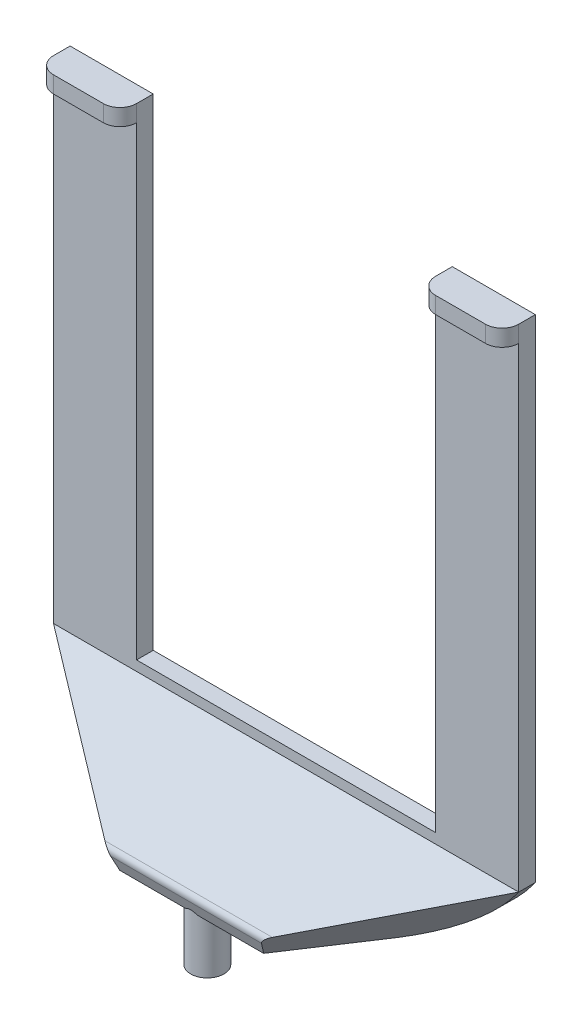
ISO-10303-21;
HEADER;
FILE_DESCRIPTION(('STEP AP214'),'2;1');
FILE_NAME('part.step','',(''),(''),'','','');
FILE_SCHEMA(('AUTOMOTIVE_DESIGN { 1 0 10303 214 1 1 1 1 }'));
ENDSEC;
DATA;
#1=APPLICATION_CONTEXT('core data for automotive mechanical design processes');
#2=APPLICATION_PROTOCOL_DEFINITION('international standard','automotive_design',2000,#1);
#3=PRODUCT_CONTEXT('',#1,'mechanical');
#4=PRODUCT('Part','Part','',(#3));
#5=PRODUCT_RELATED_PRODUCT_CATEGORY('part','',(#4));
#6=PRODUCT_DEFINITION_FORMATION('','',#4);
#7=PRODUCT_DEFINITION_CONTEXT('part definition',#1,'design');
#8=PRODUCT_DEFINITION('design','',#6,#7);
#9=PRODUCT_DEFINITION_SHAPE('','',#8);
#10=(LENGTH_UNIT() NAMED_UNIT(*) SI_UNIT(.MILLI.,.METRE.));
#11=(NAMED_UNIT(*) PLANE_ANGLE_UNIT() SI_UNIT($,.RADIAN.));
#12=(NAMED_UNIT(*) SI_UNIT($,.STERADIAN.) SOLID_ANGLE_UNIT());
#13=UNCERTAINTY_MEASURE_WITH_UNIT(LENGTH_MEASURE(1.E-05),#10,'distance_accuracy_value','');
#14=(GEOMETRIC_REPRESENTATION_CONTEXT(3) GLOBAL_UNCERTAINTY_ASSIGNED_CONTEXT((#13)) GLOBAL_UNIT_ASSIGNED_CONTEXT((#10,
#11,#12)) REPRESENTATION_CONTEXT('',''));
#15=CARTESIAN_POINT('',(0.,0.,0.));
#16=DIRECTION('',(0.,0.,1.));
#17=DIRECTION('',(1.,0.,0.));
#18=AXIS2_PLACEMENT_3D('',#15,#16,#17);
#19=CARTESIAN_POINT('',(-91.3559501162544,-90.8333333333333,5.));
#20=DIRECTION('',(1.,0.,0.));
#21=DIRECTION('',(0.,0.,-1.));
#22=AXIS2_PLACEMENT_3D('',#19,#20,#21);
#23=PLANE('',#22);
#24=DIRECTION('',(0.,0.,-1.));
#25=VECTOR('',#24,1.);
#26=CARTESIAN_POINT('',(-91.3559501162544,-93.8392083361771,25.));
#27=LINE('',#26,#25);
#28=CARTESIAN_POINT('',(-91.3559501162544,-93.8392083361771,5.));
#29=VERTEX_POINT('',#28);
#30=CARTESIAN_POINT('',(-91.3559501162544,-93.8392083361771,0.));
#31=VERTEX_POINT('',#30);
#32=EDGE_CURVE('E181',#29,#31,#27,.T.);
#33=ORIENTED_EDGE('',*,*,#32,.F.);
#34=DIRECTION('',(0.,-1.,0.));
#35=VECTOR('',#34,1.);
#36=CARTESIAN_POINT('',(-91.3559501162544,49.1666666666667,5.));
#37=LINE('',#36,#35);
#38=CARTESIAN_POINT('',(-91.3559501162544,49.1666666666667,5.));
#39=VERTEX_POINT('',#38);
#40=EDGE_CURVE('E227',#39,#29,#37,.T.);
#41=ORIENTED_EDGE('',*,*,#40,.F.);
#42=DIRECTION('',(0.,1.,0.));
#43=VECTOR('',#42,1.);
#44=CARTESIAN_POINT('',(-91.3559501162543,49.1666666666667,5.));
#45=LINE('',#44,#43);
#46=CARTESIAN_POINT('',(-91.3559501162543,54.1666666666667,5.));
#47=VERTEX_POINT('',#46);
#48=EDGE_CURVE('E325',#39,#47,#45,.T.);
#49=ORIENTED_EDGE('',*,*,#48,.T.);
#50=DIRECTION('',(0.,0.,1.));
#51=VECTOR('',#50,1.);
#52=CARTESIAN_POINT('',(-91.3559501162544,54.1666666666667,0.));
#53=LINE('',#52,#51);
#54=CARTESIAN_POINT('',(-91.3559501162544,54.1666666666667,0.));
#55=VERTEX_POINT('',#54);
#56=EDGE_CURVE('E206',#55,#47,#53,.T.);
#57=ORIENTED_EDGE('',*,*,#56,.F.);
#58=DIRECTION('',(0.,-1.,0.));
#59=VECTOR('',#58,1.);
#60=CARTESIAN_POINT('',(-91.3559501162544,-90.8333333333333,0.));
#61=LINE('',#60,#59);
#62=EDGE_CURVE('E197',#55,#31,#61,.T.);
#63=ORIENTED_EDGE('',*,*,#62,.T.);
#64=EDGE_LOOP('',(#33,#41,#49,#57,#63));
#65=FACE_BOUND('',#64,.T.);
#66=ADVANCED_FACE('F39',(#65),#23,.F.);
#67=CARTESIAN_POINT('',(48.6440498837456,-105.833333333333,0.));
#68=DIRECTION('',(0.,-0.923010028663806,-0.38477589189818));
#69=DIRECTION('',(0.,0.38477589189818,-0.923010028663806));
#70=AXIS2_PLACEMENT_3D('',#67,#68,#69);
#71=PLANE('',#70);
#72=DIRECTION('',(0.780333099666153,-0.240625028106991,0.577217332911896));
#73=VECTOR('',#72,1.);
#74=CARTESIAN_POINT('',(-4.87227608097444,-131.527895914669,61.6367590695583));
#75=LINE('',#74,#73);
#76=CARTESIAN_POINT('',(-66.3559501162543,-112.568670938579,16.1568962270722));
#77=VERTEX_POINT('',#76);
#78=CARTESIAN_POINT('',(-43.0055418271007,-119.769048127873,33.4293410340853));
#79=VERTEX_POINT('',#78);
#80=EDGE_CURVE('E240',#77,#79,#75,.T.);
#81=ORIENTED_EDGE('',*,*,#80,.F.);
#82=CARTESIAN_POINT('',(-50.3771916076654,-65.1906245824425,-97.4947457962397));
#83=DIRECTION('',(0.,-0.923010028663806,-0.38477589189818));
#84=DIRECTION('',(0.,0.38477589189818,-0.923010028663806));
#85=AXIS2_PLACEMENT_3D('',#82,#83,#84);
#86=ELLIPSE('',#85,129.945771169133,50.);
#87=CARTESIAN_POINT('',(-79.5005538000749,-105.833333333333,0.));
#88=VERTEX_POINT('',#87);
#89=EDGE_CURVE('E195',#77,#88,#86,.T.);
#90=ORIENTED_EDGE('',*,*,#89,.T.);
#91=DIRECTION('',(1.,0.,0.));
#92=VECTOR('',#91,1.);
#93=CARTESIAN_POINT('',(-91.3559501162544,-105.833333333333,0.));
#94=LINE('',#93,#92);
#95=CARTESIAN_POINT('',(36.7886535675662,-105.833333333333,0.));
#96=VERTEX_POINT('',#95);
#97=EDGE_CURVE('E205',#88,#96,#94,.T.);
#98=ORIENTED_EDGE('',*,*,#97,.T.);
#99=CARTESIAN_POINT('',(7.66529137515671,-65.1906245824425,-97.4947457962397));
#100=DIRECTION('',(0.,-0.923010028663806,-0.38477589189818));
#101=DIRECTION('',(0.,0.38477589189818,-0.923010028663806));
#102=AXIS2_PLACEMENT_3D('',#99,#100,#101);
#103=ELLIPSE('',#102,129.945771169133,50.);
#104=CARTESIAN_POINT('',(23.6440498837456,-112.568670938579,16.1568962270722));
#105=VERTEX_POINT('',#104);
#106=EDGE_CURVE('E369',#96,#105,#103,.T.);
#107=ORIENTED_EDGE('',*,*,#106,.T.);
#108=DIRECTION('',(0.780333099666153,0.240625028106991,-0.577217332911896));
#109=VECTOR('',#108,1.);
#110=CARTESIAN_POINT('',(47.4091403493079,-105.240421549071,-1.42229161054553));
#111=LINE('',#110,#109);
#112=CARTESIAN_POINT('',(0.293641594591942,-119.769048127873,33.4293410340853));
#113=VERTEX_POINT('',#112);
#114=EDGE_CURVE('E234',#113,#105,#111,.T.);
#115=ORIENTED_EDGE('',*,*,#114,.F.);
#116=DIRECTION('',(-1.,0.,0.));
#117=VECTOR('',#116,1.);
#118=CARTESIAN_POINT('',(48.6440498837456,-119.769048127873,33.4293410340853));
#119=LINE('',#118,#117);
#120=CARTESIAN_POINT('',(-19.688792021063,-119.769048127873,33.4293410340853));
#121=VERTEX_POINT('',#120);
#122=EDGE_CURVE('E267',#113,#121,#119,.T.);
#123=ORIENTED_EDGE('',*,*,#122,.T.);
#124=CARTESIAN_POINT('',(-21.3559501162544,-117.803972962328,28.7154696012142));
#125=DIRECTION('',(0.,-0.923010028663806,-0.38477589189818));
#126=DIRECTION('',(0.,0.38477589189818,-0.923010028663806));
#127=AXIS2_PLACEMENT_3D('',#124,#125,#126);
#128=ELLIPSE('',#127,5.41705923524822,5.);
#129=CARTESIAN_POINT('',(-19.7270256894861,-115.833333333333,23.9882499943124));
#130=VERTEX_POINT('',#129);
#131=EDGE_CURVE('E244',#130,#121,#128,.T.);
#132=ORIENTED_EDGE('',*,*,#131,.F.);
#133=DIRECTION('',(1.,0.,0.));
#134=VECTOR('',#133,1.);
#135=CARTESIAN_POINT('',(48.6440498837457,-115.833333333333,23.9882499943123));
#136=LINE('',#135,#134);
#137=CARTESIAN_POINT('',(-22.9848745430227,-115.833333333333,23.9882499943124));
#138=VERTEX_POINT('',#137);
#139=EDGE_CURVE('E237',#138,#130,#136,.T.);
#140=ORIENTED_EDGE('',*,*,#139,.F.);
#141=CARTESIAN_POINT('',(-23.0231082114457,-119.769048127873,33.4293410340853));
#142=VERTEX_POINT('',#141);
#143=EDGE_CURVE('E245',#142,#138,#128,.T.);
#144=ORIENTED_EDGE('',*,*,#143,.F.);
#145=EDGE_CURVE('E266',#142,#79,#119,.T.);
#146=ORIENTED_EDGE('',*,*,#145,.T.);
#147=EDGE_LOOP('',(#81,#90,#98,#107,#115,#123,#132,#140,#144,#146));
#148=FACE_BOUND('',#147,.T.);
#149=ADVANCED_FACE('F368',(#148),#71,.T.);
#150=CARTESIAN_POINT('',(48.6440498837456,-110.488005958166,-6.08230741957848));
#151=DIRECTION('',(-0.618266037198711,0.435517447007861,-0.654271855269931));
#152=DIRECTION('',(-0.726823129770258,0.,0.68682467779701));
#153=AXIS2_PLACEMENT_3D('',#150,#151,#152);
#154=PLANE('',#153);
#155=DIRECTION('',(-0.785968897124182,-0.342590714566033,0.514669306493532));
#156=VECTOR('',#155,1.);
#157=CARTESIAN_POINT('',(48.6440498837456,-93.8392083361771,4.99999999999999));
#158=LINE('',#157,#156);
#159=CARTESIAN_POINT('',(48.6440498837456,-93.8392083361771,4.99999999999999));
#160=VERTEX_POINT('',#159);
#161=CARTESIAN_POINT('',(3.83254399093332,-113.371795288117,34.3435360421655));
#162=VERTEX_POINT('',#161);
#163=EDGE_CURVE('E412',#160,#162,#158,.T.);
#164=ORIENTED_EDGE('',*,*,#163,.T.);
#165=CARTESIAN_POINT('',(3.83254399093332,-115.036675050316,33.2353053002077));
#166=DIRECTION('',(-0.618266037198711,0.435517447007861,-0.654271855269931));
#167=DIRECTION('',(-0.785968897124182,-0.342590714566033,0.514669306493532));
#168=AXIS2_PLACEMENT_3D('',#165,#166,#167);
#169=ELLIPSE('',#168,3.23485341207122,2.);
#170=CARTESIAN_POINT('',(1.33693190299864,-115.806226834112,35.0813253575353));
#171=VERTEX_POINT('',#170);
#172=EDGE_CURVE('E11',#162,#171,#169,.F.);
#173=ORIENTED_EDGE('',*,*,#172,.T.);
#174=DIRECTION('',(-0.236128838705692,-0.896908926071469,-0.37389510543042));
#175=VECTOR('',#174,1.);
#176=CARTESIAN_POINT('',(2.98950701595217,-109.529105505197,37.6980736949105));
#177=LINE('',#176,#175);
#178=EDGE_CURVE('E258',#171,#113,#177,.T.);
#179=ORIENTED_EDGE('',*,*,#178,.T.);
#180=ORIENTED_EDGE('',*,*,#114,.T.);
#181=CARTESIAN_POINT('',(7.66529137515671,-65.1906245824425,62.7936103848535));
#182=DIRECTION('',(-0.618266037198711,0.435517447007861,-0.654271855269931));
#183=DIRECTION('',(0.534887958064135,-0.376784464802276,-0.756259439214905));
#184=AXIS2_PLACEMENT_3D('',#181,#182,#183);
#185=ELLIPSE('',#184,76.4208327123771,50.);
#186=EDGE_CURVE('E250',#160,#105,#185,.T.);
#187=ORIENTED_EDGE('',*,*,#186,.F.);
#188=EDGE_LOOP('',(#164,#173,#179,#180,#187));
#189=FACE_BOUND('',#188,.T.);
#190=ADVANCED_FACE('F416',(#189),#154,.F.);
#191=CARTESIAN_POINT('',(-91.3559501162544,-110.488005958166,-6.08230741957848));
#192=DIRECTION('',(0.618266037198711,0.435517447007861,-0.654271855269931));
#193=DIRECTION('',(-0.726823129770258,0.,-0.68682467779701));
#194=AXIS2_PLACEMENT_3D('',#191,#192,#193);
#195=PLANE('',#194);
#196=DIRECTION('',(-0.236128838705692,0.896908926071469,0.37389510543042));
#197=VECTOR('',#196,1.);
#198=CARTESIAN_POINT('',(-37.8954512628711,-139.17915434452,25.3378353088866));
#199=LINE('',#198,#197);
#200=CARTESIAN_POINT('',(-44.0488321355074,-115.806226834113,35.0813253575353));
#201=VERTEX_POINT('',#200);
#202=EDGE_CURVE('E259',#79,#201,#199,.T.);
#203=ORIENTED_EDGE('',*,*,#202,.T.);
#204=CARTESIAN_POINT('',(-46.5444442234421,-115.036675050316,33.2353053002077));
#205=DIRECTION('',(0.618266037198711,0.435517447007861,-0.654271855269931));
#206=DIRECTION('',(-0.785968897124182,0.342590714566033,-0.514669306493532));
#207=AXIS2_PLACEMENT_3D('',#204,#205,#206);
#208=ELLIPSE('',#207,3.23485341207122,2.);
#209=CARTESIAN_POINT('',(-46.5444442234421,-113.371795288117,34.3435360421655));
#210=VERTEX_POINT('',#209);
#211=EDGE_CURVE('E62',#201,#210,#208,.F.);
#212=ORIENTED_EDGE('',*,*,#211,.T.);
#213=DIRECTION('',(-0.785968897124182,0.342590714566033,-0.514669306493532));
#214=VECTOR('',#213,1.);
#215=CARTESIAN_POINT('',(-91.3559501162544,-93.8392083361771,4.99999999999999));
#216=LINE('',#215,#214);
#217=EDGE_CURVE('E269',#210,#29,#216,.T.);
#218=ORIENTED_EDGE('',*,*,#217,.T.);
#219=CARTESIAN_POINT('',(-50.3771916076654,-65.1906245824425,62.7936103848535));
#220=DIRECTION('',(0.618266037198711,0.435517447007861,-0.654271855269931));
#221=DIRECTION('',(-0.534887958064135,-0.376784464802276,-0.756259439214905));
#222=AXIS2_PLACEMENT_3D('',#219,#220,#221);
#223=ELLIPSE('',#222,76.4208327123771,50.);
#224=EDGE_CURVE('E190',#77,#29,#223,.T.);
#225=ORIENTED_EDGE('',*,*,#224,.F.);
#226=ORIENTED_EDGE('',*,*,#80,.T.);
#227=EDGE_LOOP('',(#203,#212,#218,#225,#226));
#228=FACE_BOUND('',#227,.T.);
#229=ADVANCED_FACE('F262',(#228),#195,.F.);
#230=CARTESIAN_POINT('',(48.6440498837456,49.1666666666668,5.));
#231=DIRECTION('',(-1.,0.,0.));
#232=DIRECTION('',(0.,-1.,0.));
#233=AXIS2_PLACEMENT_3D('',#230,#231,#232);
#234=PLANE('',#233);
#235=DIRECTION('',(0.,1.,0.));
#236=VECTOR('',#235,1.);
#237=CARTESIAN_POINT('',(48.6440498837456,-90.8333333333332,5.));
#238=LINE('',#237,#236);
#239=CARTESIAN_POINT('',(48.6440498837456,49.1666666666667,5.));
#240=VERTEX_POINT('',#239);
#241=EDGE_CURVE('E305',#160,#240,#238,.T.);
#242=ORIENTED_EDGE('',*,*,#241,.F.);
#243=DIRECTION('',(0.,0.,-1.));
#244=VECTOR('',#243,1.);
#245=CARTESIAN_POINT('',(48.6440498837457,-93.8392083361771,25.));
#246=LINE('',#245,#244);
#247=CARTESIAN_POINT('',(48.6440498837457,-93.8392083361771,0.));
#248=VERTEX_POINT('',#247);
#249=EDGE_CURVE('E361',#160,#248,#246,.T.);
#250=ORIENTED_EDGE('',*,*,#249,.T.);
#251=DIRECTION('',(0.,1.,0.));
#252=VECTOR('',#251,1.);
#253=CARTESIAN_POINT('',(48.6440498837456,49.1666666666668,0.));
#254=LINE('',#253,#252);
#255=CARTESIAN_POINT('',(48.6440498837456,54.1666666666667,0.));
#256=VERTEX_POINT('',#255);
#257=EDGE_CURVE('E212',#248,#256,#254,.T.);
#258=ORIENTED_EDGE('',*,*,#257,.T.);
#259=DIRECTION('',(0.,0.,-1.));
#260=VECTOR('',#259,1.);
#261=CARTESIAN_POINT('',(48.6440498837456,54.1666666666667,0.));
#262=LINE('',#261,#260);
#263=CARTESIAN_POINT('',(48.6440498837456,54.1666666666667,5.));
#264=VERTEX_POINT('',#263);
#265=EDGE_CURVE('E291',#264,#256,#262,.T.);
#266=ORIENTED_EDGE('',*,*,#265,.F.);
#267=DIRECTION('',(0.,1.,0.));
#268=VECTOR('',#267,1.);
#269=CARTESIAN_POINT('',(48.6440498837456,49.1666666666667,5.));
#270=LINE('',#269,#268);
#271=EDGE_CURVE('E363',#240,#264,#270,.T.);
#272=ORIENTED_EDGE('',*,*,#271,.F.);
#273=EDGE_LOOP('',(#242,#250,#258,#266,#272));
#274=FACE_BOUND('',#273,.T.);
#275=ADVANCED_FACE('F359',(#274),#234,.F.);
#276=CARTESIAN_POINT('',(-66.3559501162544,49.1666666666667,5.));
#277=DIRECTION('',(-1.,0.,0.));
#278=DIRECTION('',(0.,-1.,0.));
#279=AXIS2_PLACEMENT_3D('',#276,#277,#278);
#280=PLANE('',#279);
#281=DIRECTION('',(0.,1.,0.));
#282=VECTOR('',#281,1.);
#283=CARTESIAN_POINT('',(-66.3559501162543,49.1666666666667,5.));
#284=LINE('',#283,#282);
#285=CARTESIAN_POINT('',(-66.3559501162543,49.1666666666667,5.));
#286=VERTEX_POINT('',#285);
#287=CARTESIAN_POINT('',(-66.3559501162543,54.1666666666667,5.));
#288=VERTEX_POINT('',#287);
#289=EDGE_CURVE('E375',#286,#288,#284,.T.);
#290=ORIENTED_EDGE('',*,*,#289,.F.);
#291=DIRECTION('',(0.,1.,0.));
#292=VECTOR('',#291,1.);
#293=CARTESIAN_POINT('',(-66.3559501162544,49.1666666666667,5.));
#294=LINE('',#293,#292);
#295=CARTESIAN_POINT('',(-66.3559501162544,-90.8333333333333,5.));
#296=VERTEX_POINT('',#295);
#297=EDGE_CURVE('E311',#296,#286,#294,.T.);
#298=ORIENTED_EDGE('',*,*,#297,.F.);
#299=DIRECTION('',(0.,0.,-1.));
#300=VECTOR('',#299,1.);
#301=CARTESIAN_POINT('',(-66.3559501162544,-90.8333333333333,5.));
#302=LINE('',#301,#300);
#303=CARTESIAN_POINT('',(-66.3559501162544,-90.8333333333333,0.));
#304=VERTEX_POINT('',#303);
#305=EDGE_CURVE('E226',#296,#304,#302,.T.);
#306=ORIENTED_EDGE('',*,*,#305,.T.);
#307=DIRECTION('',(0.,1.,0.));
#308=VECTOR('',#307,1.);
#309=CARTESIAN_POINT('',(-66.3559501162544,49.1666666666667,0.));
#310=LINE('',#309,#308);
#311=CARTESIAN_POINT('',(-66.3559501162544,54.1666666666667,0.));
#312=VERTEX_POINT('',#311);
#313=EDGE_CURVE('E223',#304,#312,#310,.T.);
#314=ORIENTED_EDGE('',*,*,#313,.T.);
#315=DIRECTION('',(0.,0.,-1.));
#316=VECTOR('',#315,1.);
#317=CARTESIAN_POINT('',(-66.3559501162544,54.1666666666667,0.));
#318=LINE('',#317,#316);
#319=EDGE_CURVE('E214',#288,#312,#318,.T.);
#320=ORIENTED_EDGE('',*,*,#319,.F.);
#321=EDGE_LOOP('',(#290,#298,#306,#314,#320));
#322=FACE_BOUND('',#321,.T.);
#323=ADVANCED_FACE('F336',(#322),#280,.F.);
#324=CARTESIAN_POINT('',(-91.3559501162544,54.1666666666667,10.));
#325=DIRECTION('',(0.,0.,-1.));
#326=DIRECTION('',(-1.,0.,0.));
#327=AXIS2_PLACEMENT_3D('',#324,#325,#326);
#328=PLANE('',#327);
#329=DIRECTION('',(0.,1.,0.));
#330=VECTOR('',#329,1.);
#331=CARTESIAN_POINT('',(-86.3559506376234,49.1666666666667,10.));
#332=LINE('',#331,#330);
#333=CARTESIAN_POINT('',(-86.3559506376234,49.1666666666667,10.));
#334=VERTEX_POINT('',#333);
#335=CARTESIAN_POINT('',(-86.3559506376234,54.1666666666667,10.));
#336=VERTEX_POINT('',#335);
#337=EDGE_CURVE('E323',#334,#336,#332,.T.);
#338=ORIENTED_EDGE('',*,*,#337,.F.);
#339=DIRECTION('',(1.,0.,0.));
#340=VECTOR('',#339,1.);
#341=CARTESIAN_POINT('',(-91.3559501162544,49.1666666666667,10.));
#342=LINE('',#341,#340);
#343=CARTESIAN_POINT('',(-71.3559495948853,49.1666666666667,10.));
#344=VERTEX_POINT('',#343);
#345=EDGE_CURVE('E283',#334,#344,#342,.T.);
#346=ORIENTED_EDGE('',*,*,#345,.T.);
#347=DIRECTION('',(0.,1.,0.));
#348=VECTOR('',#347,1.);
#349=CARTESIAN_POINT('',(-71.3559495948853,49.1666666666667,10.));
#350=LINE('',#349,#348);
#351=CARTESIAN_POINT('',(-71.3559495948853,54.1666666666667,10.));
#352=VERTEX_POINT('',#351);
#353=EDGE_CURVE('E376',#344,#352,#350,.T.);
#354=ORIENTED_EDGE('',*,*,#353,.T.);
#355=DIRECTION('',(1.,0.,0.));
#356=VECTOR('',#355,1.);
#357=CARTESIAN_POINT('',(-91.3559501162544,54.1666666666667,10.));
#358=LINE('',#357,#356);
#359=EDGE_CURVE('E278',#336,#352,#358,.T.);
#360=ORIENTED_EDGE('',*,*,#359,.F.);
#361=EDGE_LOOP('',(#338,#346,#354,#360));
#362=FACE_BOUND('',#361,.T.);
#363=ADVANCED_FACE('F439',(#362),#328,.F.);
#364=CARTESIAN_POINT('',(0.,54.1666666666667,0.));
#365=DIRECTION('',(0.,1.,0.));
#366=DIRECTION('',(0.,0.,1.));
#367=AXIS2_PLACEMENT_3D('',#364,#365,#366);
#368=PLANE('',#367);
#369=CARTESIAN_POINT('',(-86.3559506376234,54.1666666666667,5.));
#370=DIRECTION('',(0.,-1.,0.));
#371=DIRECTION('',(0.,0.,1.));
#372=AXIS2_PLACEMENT_3D('',#369,#370,#371);
#373=CIRCLE('',#372,4.99999973931547);
#374=EDGE_CURVE('E326',#336,#47,#373,.T.);
#375=ORIENTED_EDGE('',*,*,#374,.F.);
#376=ORIENTED_EDGE('',*,*,#359,.T.);
#377=CARTESIAN_POINT('',(-71.3559495948853,54.1666666666667,5.));
#378=DIRECTION('',(0.,-1.,0.));
#379=DIRECTION('',(0.,0.,-1.));
#380=AXIS2_PLACEMENT_3D('',#377,#378,#379);
#381=CIRCLE('',#380,4.99999973931547);
#382=EDGE_CURVE('E382',#288,#352,#381,.T.);
#383=ORIENTED_EDGE('',*,*,#382,.F.);
#384=ORIENTED_EDGE('',*,*,#319,.T.);
#385=DIRECTION('',(-1.,0.,0.));
#386=VECTOR('',#385,1.);
#387=CARTESIAN_POINT('',(-91.3559501162544,54.1666666666667,0.));
#388=LINE('',#387,#386);
#389=EDGE_CURVE('E209',#312,#55,#388,.T.);
#390=ORIENTED_EDGE('',*,*,#389,.T.);
#391=ORIENTED_EDGE('',*,*,#56,.T.);
#392=EDGE_LOOP('',(#375,#376,#383,#384,#390,#391));
#393=FACE_BOUND('',#392,.T.);
#394=ADVANCED_FACE('F330',(#393),#368,.T.);
#395=CARTESIAN_POINT('',(0.,49.1666666666667,0.));
#396=DIRECTION('',(0.,1.,0.));
#397=DIRECTION('',(0.,0.,1.));
#398=AXIS2_PLACEMENT_3D('',#395,#396,#397);
#399=PLANE('',#398);
#400=ORIENTED_EDGE('',*,*,#345,.F.);
#401=CARTESIAN_POINT('',(-86.3559506376234,49.1666666666667,5.));
#402=DIRECTION('',(0.,-1.,0.));
#403=DIRECTION('',(0.,0.,1.));
#404=AXIS2_PLACEMENT_3D('',#401,#402,#403);
#405=CIRCLE('',#404,4.99999973931547);
#406=EDGE_CURVE('E321',#334,#39,#405,.T.);
#407=ORIENTED_EDGE('',*,*,#406,.T.);
#408=DIRECTION('',(-1.,0.,0.));
#409=VECTOR('',#408,1.);
#410=CARTESIAN_POINT('',(-91.3559501162544,49.1666666666667,5.));
#411=LINE('',#410,#409);
#412=EDGE_CURVE('E218',#286,#39,#411,.T.);
#413=ORIENTED_EDGE('',*,*,#412,.F.);
#414=CARTESIAN_POINT('',(-71.3559495948853,49.1666666666667,5.));
#415=DIRECTION('',(0.,-1.,0.));
#416=DIRECTION('',(0.,0.,-1.));
#417=AXIS2_PLACEMENT_3D('',#414,#415,#416);
#418=CIRCLE('',#417,4.99999973931547);
#419=EDGE_CURVE('E378',#286,#344,#418,.T.);
#420=ORIENTED_EDGE('',*,*,#419,.T.);
#421=EDGE_LOOP('',(#400,#407,#413,#420));
#422=FACE_BOUND('',#421,.T.);
#423=ADVANCED_FACE('F451',(#422),#399,.F.);
#424=CARTESIAN_POINT('',(23.6440498837456,54.1666666666667,10.));
#425=DIRECTION('',(0.,0.,-1.));
#426=DIRECTION('',(-1.,0.,0.));
#427=AXIS2_PLACEMENT_3D('',#424,#425,#426);
#428=PLANE('',#427);
#429=DIRECTION('',(1.,0.,0.));
#430=VECTOR('',#429,1.);
#431=CARTESIAN_POINT('',(23.6440498837456,49.1666666666667,10.));
#432=LINE('',#431,#430);
#433=CARTESIAN_POINT('',(28.6440493623766,49.1666666666667,10.));
#434=VERTEX_POINT('',#433);
#435=CARTESIAN_POINT('',(43.6440504051147,49.1666666666667,10.));
#436=VERTEX_POINT('',#435);
#437=EDGE_CURVE('E290',#434,#436,#432,.T.);
#438=ORIENTED_EDGE('',*,*,#437,.T.);
#439=DIRECTION('',(0.,1.,0.));
#440=VECTOR('',#439,1.);
#441=CARTESIAN_POINT('',(43.6440504051147,49.1666666666667,10.));
#442=LINE('',#441,#440);
#443=CARTESIAN_POINT('',(43.6440504051147,54.1666666666667,10.));
#444=VERTEX_POINT('',#443);
#445=EDGE_CURVE('E381',#436,#444,#442,.T.);
#446=ORIENTED_EDGE('',*,*,#445,.T.);
#447=DIRECTION('',(1.,0.,0.));
#448=VECTOR('',#447,1.);
#449=CARTESIAN_POINT('',(23.6440498837456,54.1666666666667,10.));
#450=LINE('',#449,#448);
#451=CARTESIAN_POINT('',(28.6440493623766,54.1666666666667,10.));
#452=VERTEX_POINT('',#451);
#453=EDGE_CURVE('E298',#452,#444,#450,.T.);
#454=ORIENTED_EDGE('',*,*,#453,.F.);
#455=DIRECTION('',(0.,1.,0.));
#456=VECTOR('',#455,1.);
#457=CARTESIAN_POINT('',(28.6440493623766,49.1666666666667,10.));
#458=LINE('',#457,#456);
#459=EDGE_CURVE('E402',#434,#452,#458,.T.);
#460=ORIENTED_EDGE('',*,*,#459,.F.);
#461=EDGE_LOOP('',(#438,#446,#454,#460));
#462=FACE_BOUND('',#461,.T.);
#463=ADVANCED_FACE('F449',(#462),#428,.F.);
#464=CARTESIAN_POINT('',(0.,54.1666666666667,0.));
#465=DIRECTION('',(0.,1.,0.));
#466=DIRECTION('',(0.,0.,1.));
#467=AXIS2_PLACEMENT_3D('',#464,#465,#466);
#468=PLANE('',#467);
#469=CARTESIAN_POINT('',(43.6440504051147,54.1666666666667,5.));
#470=DIRECTION('',(0.,-1.,0.));
#471=DIRECTION('',(0.,0.,-1.));
#472=AXIS2_PLACEMENT_3D('',#469,#470,#471);
#473=CIRCLE('',#472,4.99999973931548);
#474=EDGE_CURVE('E358',#264,#444,#473,.T.);
#475=ORIENTED_EDGE('',*,*,#474,.F.);
#476=ORIENTED_EDGE('',*,*,#265,.T.);
#477=DIRECTION('',(-1.,0.,0.));
#478=VECTOR('',#477,1.);
#479=CARTESIAN_POINT('',(23.6440498837456,54.1666666666667,0.));
#480=LINE('',#479,#478);
#481=CARTESIAN_POINT('',(23.6440498837456,54.1666666666667,0.));
#482=VERTEX_POINT('',#481);
#483=EDGE_CURVE('E277',#256,#482,#480,.T.);
#484=ORIENTED_EDGE('',*,*,#483,.T.);
#485=DIRECTION('',(0.,0.,1.));
#486=VECTOR('',#485,1.);
#487=CARTESIAN_POINT('',(23.6440498837456,54.1666666666667,0.));
#488=LINE('',#487,#486);
#489=CARTESIAN_POINT('',(23.6440498837456,54.1666666666667,5.));
#490=VERTEX_POINT('',#489);
#491=EDGE_CURVE('E289',#482,#490,#488,.T.);
#492=ORIENTED_EDGE('',*,*,#491,.T.);
#493=CARTESIAN_POINT('',(28.6440493623766,54.1666666666667,5.));
#494=DIRECTION('',(0.,-1.,0.));
#495=DIRECTION('',(0.,0.,1.));
#496=AXIS2_PLACEMENT_3D('',#493,#494,#495);
#497=CIRCLE('',#496,4.99999973931548);
#498=EDGE_CURVE('E388',#452,#490,#497,.T.);
#499=ORIENTED_EDGE('',*,*,#498,.F.);
#500=ORIENTED_EDGE('',*,*,#453,.T.);
#501=EDGE_LOOP('',(#475,#476,#484,#492,#499,#500));
#502=FACE_BOUND('',#501,.T.);
#503=ADVANCED_FACE('F352',(#502),#468,.T.);
#504=CARTESIAN_POINT('',(0.,49.1666666666667,0.));
#505=DIRECTION('',(0.,1.,0.));
#506=DIRECTION('',(0.,0.,1.));
#507=AXIS2_PLACEMENT_3D('',#504,#505,#506);
#508=PLANE('',#507);
#509=DIRECTION('',(-1.,0.,0.));
#510=VECTOR('',#509,1.);
#511=CARTESIAN_POINT('',(23.6440498837456,49.1666666666668,5.));
#512=LINE('',#511,#510);
#513=CARTESIAN_POINT('',(23.6440498837456,49.1666666666668,5.));
#514=VERTEX_POINT('',#513);
#515=EDGE_CURVE('E304',#240,#514,#512,.T.);
#516=ORIENTED_EDGE('',*,*,#515,.F.);
#517=CARTESIAN_POINT('',(43.6440504051147,49.1666666666667,5.));
#518=DIRECTION('',(0.,-1.,0.));
#519=DIRECTION('',(0.,0.,-1.));
#520=AXIS2_PLACEMENT_3D('',#517,#518,#519);
#521=CIRCLE('',#520,4.99999973931548);
#522=EDGE_CURVE('E390',#240,#436,#521,.T.);
#523=ORIENTED_EDGE('',*,*,#522,.T.);
#524=ORIENTED_EDGE('',*,*,#437,.F.);
#525=CARTESIAN_POINT('',(28.6440493623766,49.1666666666667,5.));
#526=DIRECTION('',(0.,-1.,0.));
#527=DIRECTION('',(0.,0.,1.));
#528=AXIS2_PLACEMENT_3D('',#525,#526,#527);
#529=CIRCLE('',#528,4.99999973931548);
#530=EDGE_CURVE('E396',#434,#514,#529,.T.);
#531=ORIENTED_EDGE('',*,*,#530,.T.);
#532=EDGE_LOOP('',(#516,#523,#524,#531));
#533=FACE_BOUND('',#532,.T.);
#534=ADVANCED_FACE('F434',(#533),#508,.F.);
#535=CARTESIAN_POINT('',(23.6440498837456,49.1666666666668,5.));
#536=DIRECTION('',(1.,0.,0.));
#537=DIRECTION('',(0.,1.,0.));
#538=AXIS2_PLACEMENT_3D('',#535,#536,#537);
#539=PLANE('',#538);
#540=DIRECTION('',(0.,-1.,0.));
#541=VECTOR('',#540,1.);
#542=CARTESIAN_POINT('',(23.6440498837456,49.1666666666668,5.));
#543=LINE('',#542,#541);
#544=CARTESIAN_POINT('',(23.6440498837456,-90.8333333333332,5.));
#545=VERTEX_POINT('',#544);
#546=EDGE_CURVE('E308',#514,#545,#543,.T.);
#547=ORIENTED_EDGE('',*,*,#546,.F.);
#548=DIRECTION('',(0.,1.,0.));
#549=VECTOR('',#548,1.);
#550=CARTESIAN_POINT('',(23.6440498837456,49.1666666666667,5.));
#551=LINE('',#550,#549);
#552=EDGE_CURVE('E398',#514,#490,#551,.T.);
#553=ORIENTED_EDGE('',*,*,#552,.T.);
#554=ORIENTED_EDGE('',*,*,#491,.F.);
#555=DIRECTION('',(0.,-1.,0.));
#556=VECTOR('',#555,1.);
#557=CARTESIAN_POINT('',(23.6440498837456,49.1666666666668,0.));
#558=LINE('',#557,#556);
#559=CARTESIAN_POINT('',(23.6440498837456,-90.8333333333332,0.));
#560=VERTEX_POINT('',#559);
#561=EDGE_CURVE('E216',#482,#560,#558,.T.);
#562=ORIENTED_EDGE('',*,*,#561,.T.);
#563=DIRECTION('',(0.,0.,-1.));
#564=VECTOR('',#563,1.);
#565=CARTESIAN_POINT('',(23.6440498837456,-90.8333333333332,5.));
#566=LINE('',#565,#564);
#567=EDGE_CURVE('E233',#545,#560,#566,.T.);
#568=ORIENTED_EDGE('',*,*,#567,.F.);
#569=EDGE_LOOP('',(#547,#553,#554,#562,#568));
#570=FACE_BOUND('',#569,.T.);
#571=ADVANCED_FACE('F348',(#570),#539,.F.);
#572=CARTESIAN_POINT('',(-66.3559501162544,-90.8333333333333,5.));
#573=DIRECTION('',(0.,-1.,0.));
#574=DIRECTION('',(1.,0.,0.));
#575=AXIS2_PLACEMENT_3D('',#572,#573,#574);
#576=PLANE('',#575);
#577=DIRECTION('',(-1.,0.,0.));
#578=VECTOR('',#577,1.);
#579=CARTESIAN_POINT('',(-66.3559501162544,-90.8333333333333,0.));
#580=LINE('',#579,#578);
#581=EDGE_CURVE('E225',#560,#304,#580,.T.);
#582=ORIENTED_EDGE('',*,*,#581,.T.);
#583=ORIENTED_EDGE('',*,*,#305,.F.);
#584=DIRECTION('',(-1.,0.,0.));
#585=VECTOR('',#584,1.);
#586=CARTESIAN_POINT('',(-66.3559501162544,-90.8333333333333,5.));
#587=LINE('',#586,#585);
#588=EDGE_CURVE('E309',#545,#296,#587,.T.);
#589=ORIENTED_EDGE('',*,*,#588,.F.);
#590=ORIENTED_EDGE('',*,*,#567,.T.);
#591=EDGE_LOOP('',(#582,#583,#589,#590));
#592=FACE_BOUND('',#591,.T.);
#593=ADVANCED_FACE('F345',(#592),#576,.F.);
#594=CARTESIAN_POINT('',(0.,0.,5.));
#595=DIRECTION('',(0.,0.,1.));
#596=DIRECTION('',(1.,0.,0.));
#597=AXIS2_PLACEMENT_3D('',#594,#595,#596);
#598=PLANE('',#597);
#599=DIRECTION('',(-1.,0.,0.));
#600=VECTOR('',#599,1.);
#601=CARTESIAN_POINT('',(48.6440498837456,-93.8392083361771,4.99999999999999));
#602=LINE('',#601,#600);
#603=EDGE_CURVE('E274',#160,#29,#602,.T.);
#604=ORIENTED_EDGE('',*,*,#603,.F.);
#605=ORIENTED_EDGE('',*,*,#241,.T.);
#606=ORIENTED_EDGE('',*,*,#515,.T.);
#607=ORIENTED_EDGE('',*,*,#546,.T.);
#608=ORIENTED_EDGE('',*,*,#588,.T.);
#609=ORIENTED_EDGE('',*,*,#297,.T.);
#610=ORIENTED_EDGE('',*,*,#412,.T.);
#611=ORIENTED_EDGE('',*,*,#40,.T.);
#612=EDGE_LOOP('',(#604,#605,#606,#607,#608,#609,#610,#611));
#613=FACE_BOUND('',#612,.T.);
#614=ADVANCED_FACE('F319',(#613),#598,.T.);
#615=CARTESIAN_POINT('',(0.,0.,0.));
#616=DIRECTION('',(0.,0.,1.));
#617=DIRECTION('',(1.,0.,0.));
#618=AXIS2_PLACEMENT_3D('',#615,#616,#617);
#619=PLANE('',#618);
#620=ORIENTED_EDGE('',*,*,#97,.F.);
#621=CARTESIAN_POINT('',(-50.3771916076654,-65.1906245824425,0.));
#622=DIRECTION('',(0.,0.,-1.));
#623=DIRECTION('',(1.,0.,0.));
#624=AXIS2_PLACEMENT_3D('',#621,#622,#623);
#625=CIRCLE('',#624,50.);
#626=EDGE_CURVE('E183',#88,#31,#625,.T.);
#627=ORIENTED_EDGE('',*,*,#626,.T.);
#628=ORIENTED_EDGE('',*,*,#62,.F.);
#629=ORIENTED_EDGE('',*,*,#389,.F.);
#630=ORIENTED_EDGE('',*,*,#313,.F.);
#631=ORIENTED_EDGE('',*,*,#581,.F.);
#632=ORIENTED_EDGE('',*,*,#561,.F.);
#633=ORIENTED_EDGE('',*,*,#483,.F.);
#634=ORIENTED_EDGE('',*,*,#257,.F.);
#635=CARTESIAN_POINT('',(7.66529137515671,-65.1906245824425,0.));
#636=DIRECTION('',(0.,0.,-1.));
#637=DIRECTION('',(-1.,0.,0.));
#638=AXIS2_PLACEMENT_3D('',#635,#636,#637);
#639=CIRCLE('',#638,50.);
#640=EDGE_CURVE('E202',#248,#96,#639,.T.);
#641=ORIENTED_EDGE('',*,*,#640,.T.);
#642=EDGE_LOOP('',(#620,#627,#628,#629,#630,#631,#632,#633,#634,#641));
#643=FACE_BOUND('',#642,.T.);
#644=ADVANCED_FACE('F198',(#643),#619,.F.);
#645=CARTESIAN_POINT('',(48.6440498837456,-114.28502576913,35.7154696012143));
#646=DIRECTION('',(0.,0.832439881099464,0.554115370978923));
#647=DIRECTION('',(0.,-0.554115370978923,0.832439881099464));
#648=AXIS2_PLACEMENT_3D('',#645,#646,#647);
#649=PLANE('',#648);
#650=ORIENTED_EDGE('',*,*,#217,.F.);
#651=DIRECTION('',(-1.,0.,0.));
#652=VECTOR('',#651,1.);
#653=CARTESIAN_POINT('',(48.6440498837456,-113.371795288117,34.3435360421656));
#654=LINE('',#653,#652);
#655=EDGE_CURVE('E50',#210,#162,#654,.F.);
#656=ORIENTED_EDGE('',*,*,#655,.T.);
#657=ORIENTED_EDGE('',*,*,#163,.F.);
#658=ORIENTED_EDGE('',*,*,#603,.T.);
#659=EDGE_LOOP('',(#650,#656,#657,#658));
#660=FACE_BOUND('',#659,.T.);
#661=ADVANCED_FACE('F442',(#660),#649,.T.);
#662=CARTESIAN_POINT('',(48.6440498837456,-119.769048127873,33.4293410340853));
#663=DIRECTION('',(0.,-0.38477589189818,0.923010028663806));
#664=DIRECTION('',(0.,-0.923010028663806,-0.38477589189818));
#665=AXIS2_PLACEMENT_3D('',#662,#663,#664);
#666=PLANE('',#665);
#667=ORIENTED_EDGE('',*,*,#178,.F.);
#668=DIRECTION('',(-1.,0.,0.));
#669=VECTOR('',#668,1.);
#670=CARTESIAN_POINT('',(48.6440498837456,-115.806226834112,35.0813253575353));
#671=LINE('',#670,#669);
#672=EDGE_CURVE('E248',#171,#201,#671,.T.);
#673=ORIENTED_EDGE('',*,*,#672,.T.);
#674=ORIENTED_EDGE('',*,*,#202,.F.);
#675=ORIENTED_EDGE('',*,*,#145,.F.);
#676=CARTESIAN_POINT('',(-21.3559501162544,-131.076800765149,28.7154696012142));
#677=DIRECTION('',(0.,-0.38477589189818,0.923010028663806));
#678=DIRECTION('',(0.,0.923010028663806,0.38477589189818));
#679=AXIS2_PLACEMENT_3D('',#676,#677,#678);
#680=ELLIPSE('',#679,12.9945771169133,5.);
#681=EDGE_CURVE('E409',#121,#142,#680,.T.);
#682=ORIENTED_EDGE('',*,*,#681,.F.);
#683=ORIENTED_EDGE('',*,*,#122,.F.);
#684=EDGE_LOOP('',(#667,#673,#674,#675,#682,#683));
#685=FACE_BOUND('',#684,.T.);
#686=ADVANCED_FACE('F257',(#685),#666,.T.);
#687=CARTESIAN_POINT('',(-21.3559501162544,-135.833333333333,28.7154696012142));
#688=DIRECTION('',(0.,1.,0.));
#689=DIRECTION('',(-1.,0.,0.));
#690=AXIS2_PLACEMENT_3D('',#687,#688,#689);
#691=CYLINDRICAL_SURFACE('',#690,5.);
#692=CARTESIAN_POINT('',(-21.3559501162544,-135.833333333333,28.7154696012142));
#693=DIRECTION('',(0.,1.,0.));
#694=DIRECTION('',(-1.,0.,0.));
#695=AXIS2_PLACEMENT_3D('',#692,#693,#694);
#696=CIRCLE('',#695,5.);
#697=CARTESIAN_POINT('',(-26.3559501162544,-135.833333333333,28.7154696012142));
#698=VERTEX_POINT('',#697);
#699=EDGE_CURVE('E403',#698,#698,#696,.T.);
#700=ORIENTED_EDGE('',*,*,#699,.T.);
#701=EDGE_LOOP('',(#700));
#702=FACE_BOUND('',#701,.T.);
#703=CARTESIAN_POINT('',(-21.3559501162544,-115.833333333333,28.7154696012142));
#704=DIRECTION('',(0.,1.,0.));
#705=DIRECTION('',(-1.,0.,0.));
#706=AXIS2_PLACEMENT_3D('',#703,#704,#705);
#707=CIRCLE('',#706,5.);
#708=EDGE_CURVE('E401',#130,#138,#707,.T.);
#709=ORIENTED_EDGE('',*,*,#708,.F.);
#710=ORIENTED_EDGE('',*,*,#131,.T.);
#711=ORIENTED_EDGE('',*,*,#681,.T.);
#712=ORIENTED_EDGE('',*,*,#143,.T.);
#713=EDGE_LOOP('',(#709,#710,#711,#712));
#714=FACE_BOUND('',#713,.T.);
#715=ADVANCED_FACE('F463',(#702,#714),#691,.T.);
#716=CARTESIAN_POINT('',(-21.3559501162544,-135.833333333333,28.7154696012142));
#717=DIRECTION('',(0.,1.,0.));
#718=DIRECTION('',(-1.,0.,0.));
#719=AXIS2_PLACEMENT_3D('',#716,#717,#718);
#720=PLANE('',#719);
#721=ORIENTED_EDGE('',*,*,#699,.F.);
#722=EDGE_LOOP('',(#721));
#723=FACE_BOUND('',#722,.T.);
#724=ADVANCED_FACE('F474',(#723),#720,.F.);
#725=CARTESIAN_POINT('',(-21.3559501162544,-115.833333333333,28.7154696012142));
#726=DIRECTION('',(0.,1.,0.));
#727=DIRECTION('',(-1.,0.,0.));
#728=AXIS2_PLACEMENT_3D('',#725,#726,#727);
#729=PLANE('',#728);
#730=ORIENTED_EDGE('',*,*,#708,.T.);
#731=ORIENTED_EDGE('',*,*,#139,.T.);
#732=EDGE_LOOP('',(#730,#731));
#733=FACE_BOUND('',#732,.T.);
#734=ADVANCED_FACE('F473',(#733),#729,.T.);
#735=CARTESIAN_POINT('',(28.6440493623766,49.1666666666667,5.));
#736=DIRECTION('',(0.,1.,0.));
#737=DIRECTION('',(0.,0.,1.));
#738=AXIS2_PLACEMENT_3D('',#735,#736,#737);
#739=CYLINDRICAL_SURFACE('',#738,4.99999973931548);
#740=ORIENTED_EDGE('',*,*,#498,.T.);
#741=ORIENTED_EDGE('',*,*,#552,.F.);
#742=ORIENTED_EDGE('',*,*,#530,.F.);
#743=ORIENTED_EDGE('',*,*,#459,.T.);
#744=EDGE_LOOP('',(#740,#741,#742,#743));
#745=FACE_BOUND('',#744,.T.);
#746=ADVANCED_FACE('F477',(#745),#739,.T.);
#747=CARTESIAN_POINT('',(43.6440504051147,49.1666666666667,5.));
#748=DIRECTION('',(0.,1.,0.));
#749=DIRECTION('',(0.,0.,1.));
#750=AXIS2_PLACEMENT_3D('',#747,#748,#749);
#751=CYLINDRICAL_SURFACE('',#750,4.99999973931548);
#752=ORIENTED_EDGE('',*,*,#474,.T.);
#753=ORIENTED_EDGE('',*,*,#445,.F.);
#754=ORIENTED_EDGE('',*,*,#522,.F.);
#755=ORIENTED_EDGE('',*,*,#271,.T.);
#756=EDGE_LOOP('',(#752,#753,#754,#755));
#757=FACE_BOUND('',#756,.T.);
#758=ADVANCED_FACE('F484',(#757),#751,.T.);
#759=CARTESIAN_POINT('',(-71.3559495948853,49.1666666666667,5.));
#760=DIRECTION('',(0.,1.,0.));
#761=DIRECTION('',(0.,0.,1.));
#762=AXIS2_PLACEMENT_3D('',#759,#760,#761);
#763=CYLINDRICAL_SURFACE('',#762,4.99999973931547);
#764=ORIENTED_EDGE('',*,*,#382,.T.);
#765=ORIENTED_EDGE('',*,*,#353,.F.);
#766=ORIENTED_EDGE('',*,*,#419,.F.);
#767=ORIENTED_EDGE('',*,*,#289,.T.);
#768=EDGE_LOOP('',(#764,#765,#766,#767));
#769=FACE_BOUND('',#768,.T.);
#770=ADVANCED_FACE('F490',(#769),#763,.T.);
#771=CARTESIAN_POINT('',(-86.3559506376234,49.1666666666667,5.));
#772=DIRECTION('',(0.,1.,0.));
#773=DIRECTION('',(0.,0.,1.));
#774=AXIS2_PLACEMENT_3D('',#771,#772,#773);
#775=CYLINDRICAL_SURFACE('',#774,4.99999973931547);
#776=ORIENTED_EDGE('',*,*,#374,.T.);
#777=ORIENTED_EDGE('',*,*,#48,.F.);
#778=ORIENTED_EDGE('',*,*,#406,.F.);
#779=ORIENTED_EDGE('',*,*,#337,.T.);
#780=EDGE_LOOP('',(#776,#777,#778,#779));
#781=FACE_BOUND('',#780,.T.);
#782=ADVANCED_FACE('F487',(#781),#775,.T.);
#783=CARTESIAN_POINT('',(-50.3771916076654,-65.1906245824425,25.));
#784=DIRECTION('',(0.,0.,-1.));
#785=DIRECTION('',(-1.,0.,0.));
#786=AXIS2_PLACEMENT_3D('',#783,#784,#785);
#787=CYLINDRICAL_SURFACE('',#786,50.);
#788=ORIENTED_EDGE('',*,*,#224,.T.);
#789=ORIENTED_EDGE('',*,*,#32,.T.);
#790=ORIENTED_EDGE('',*,*,#626,.F.);
#791=ORIENTED_EDGE('',*,*,#89,.F.);
#792=EDGE_LOOP('',(#788,#789,#790,#791));
#793=FACE_BOUND('',#792,.T.);
#794=ADVANCED_FACE('F182',(#793),#787,.T.);
#795=CARTESIAN_POINT('',(7.66529137515671,-65.1906245824425,25.));
#796=DIRECTION('',(0.,0.,-1.));
#797=DIRECTION('',(-1.,0.,0.));
#798=AXIS2_PLACEMENT_3D('',#795,#796,#797);
#799=CYLINDRICAL_SURFACE('',#798,50.);
#800=ORIENTED_EDGE('',*,*,#640,.F.);
#801=ORIENTED_EDGE('',*,*,#249,.F.);
#802=ORIENTED_EDGE('',*,*,#186,.T.);
#803=ORIENTED_EDGE('',*,*,#106,.F.);
#804=EDGE_LOOP('',(#800,#801,#802,#803));
#805=FACE_BOUND('',#804,.T.);
#806=ADVANCED_FACE('F417',(#805),#799,.T.);
#807=CARTESIAN_POINT('',(48.6440498837456,-115.036675050316,33.2353053002077));
#808=DIRECTION('',(-1.,0.,0.));
#809=DIRECTION('',(0.,0.,1.));
#810=AXIS2_PLACEMENT_3D('',#807,#808,#809);
#811=CYLINDRICAL_SURFACE('',#810,2.);
#812=ORIENTED_EDGE('',*,*,#172,.F.);
#813=ORIENTED_EDGE('',*,*,#655,.F.);
#814=ORIENTED_EDGE('',*,*,#211,.F.);
#815=ORIENTED_EDGE('',*,*,#672,.F.);
#816=EDGE_LOOP('',(#812,#813,#814,#815));
#817=FACE_BOUND('',#816,.T.);
#818=ADVANCED_FACE('F41',(#817),#811,.T.);
#819=CLOSED_SHELL('',(#66,#149,#190,#229,#275,#323,#363,#394,#423,#463,#503,#534,#571,#593,#614,
#644,#661,#686,#715,#724,#734,#746,#758,#770,#782,#794,#806,#818));
#820=MANIFOLD_SOLID_BREP('B2',#819);
#821=ADVANCED_BREP_SHAPE_REPRESENTATION('',(#18,#820),#14);
#822=SHAPE_DEFINITION_REPRESENTATION(#9,#821);
ENDSEC;
END-ISO-10303-21;
